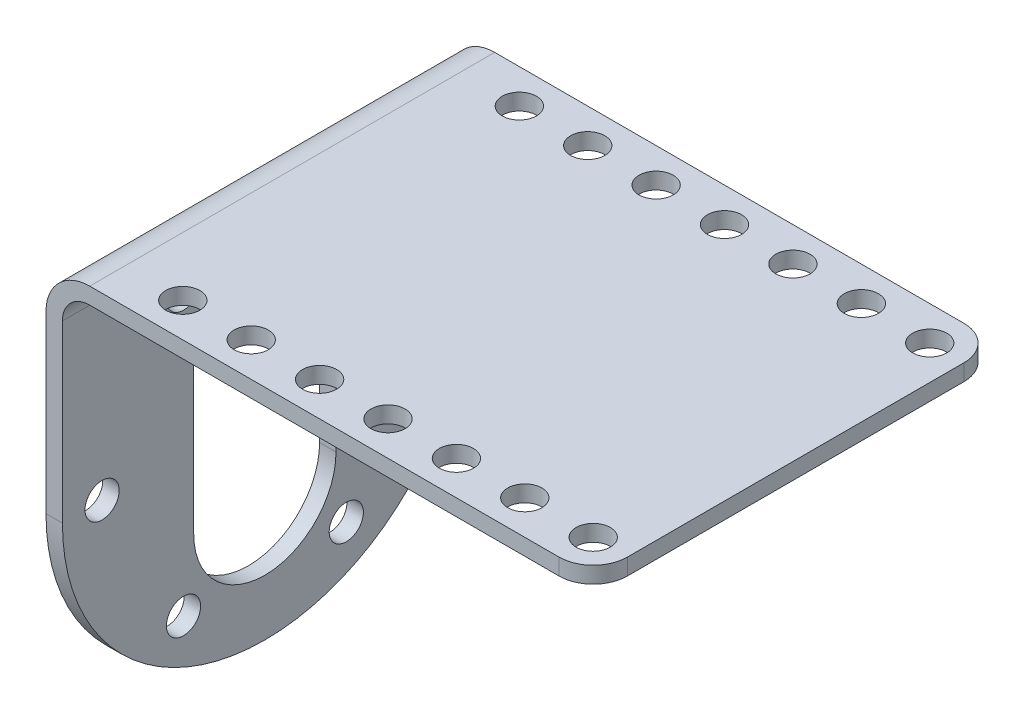
ISO-10303-21;
HEADER;
FILE_DESCRIPTION(('STEP AP214'),'2;1');
FILE_NAME('part.step','',(''),(''),'','','');
FILE_SCHEMA(('AUTOMOTIVE_DESIGN { 1 0 10303 214 1 1 1 1 }'));
ENDSEC;
DATA;
#1=APPLICATION_CONTEXT('core data for automotive mechanical design processes');
#2=APPLICATION_PROTOCOL_DEFINITION('international standard','automotive_design',2000,#1);
#3=PRODUCT_CONTEXT('',#1,'mechanical');
#4=PRODUCT('Part','Part','',(#3));
#5=PRODUCT_RELATED_PRODUCT_CATEGORY('part','',(#4));
#6=PRODUCT_DEFINITION_FORMATION('','',#4);
#7=PRODUCT_DEFINITION_CONTEXT('part definition',#1,'design');
#8=PRODUCT_DEFINITION('design','',#6,#7);
#9=PRODUCT_DEFINITION_SHAPE('','',#8);
#10=(LENGTH_UNIT() NAMED_UNIT(*) SI_UNIT(.MILLI.,.METRE.));
#11=(NAMED_UNIT(*) PLANE_ANGLE_UNIT() SI_UNIT($,.RADIAN.));
#12=(NAMED_UNIT(*) SI_UNIT($,.STERADIAN.) SOLID_ANGLE_UNIT());
#13=UNCERTAINTY_MEASURE_WITH_UNIT(LENGTH_MEASURE(1.E-05),#10,'distance_accuracy_value','');
#14=(GEOMETRIC_REPRESENTATION_CONTEXT(3) GLOBAL_UNCERTAINTY_ASSIGNED_CONTEXT((#13)) GLOBAL_UNIT_ASSIGNED_CONTEXT((#10,
#11,#12)) REPRESENTATION_CONTEXT('',''));
#15=CARTESIAN_POINT('',(0.,0.,0.));
#16=DIRECTION('',(0.,0.,1.));
#17=DIRECTION('',(1.,0.,0.));
#18=AXIS2_PLACEMENT_3D('',#15,#16,#17);
#19=CARTESIAN_POINT('',(4.064,39.116,18.796));
#20=DIRECTION('',(0.,-1.,0.));
#21=DIRECTION('',(0.,0.,-1.));
#22=AXIS2_PLACEMENT_3D('',#19,#20,#21);
#23=PLANE('',#22);
#24=CARTESIAN_POINT('',(9.52499999999999,39.116,15.621));
#25=DIRECTION('',(0.,1.,0.));
#26=DIRECTION('',(0.,0.,1.));
#27=AXIS2_PLACEMENT_3D('',#24,#25,#26);
#28=CIRCLE('',#27,1.5875);
#29=CARTESIAN_POINT('',(9.52499999999999,39.116,17.2085));
#30=VERTEX_POINT('',#29);
#31=EDGE_CURVE('E645',#30,#30,#28,.T.);
#32=ORIENTED_EDGE('',*,*,#31,.F.);
#33=EDGE_LOOP('',(#32));
#34=FACE_BOUND('',#33,.T.);
#35=CARTESIAN_POINT('',(15.875,39.116,15.621));
#36=DIRECTION('',(0.,1.,0.));
#37=DIRECTION('',(0.,0.,1.));
#38=AXIS2_PLACEMENT_3D('',#35,#36,#37);
#39=CIRCLE('',#38,1.5875);
#40=CARTESIAN_POINT('',(15.875,39.116,17.2085));
#41=VERTEX_POINT('',#40);
#42=EDGE_CURVE('E649',#41,#41,#39,.T.);
#43=ORIENTED_EDGE('',*,*,#42,.F.);
#44=EDGE_LOOP('',(#43));
#45=FACE_BOUND('',#44,.T.);
#46=CARTESIAN_POINT('',(22.225,39.116,15.621));
#47=DIRECTION('',(0.,1.,0.));
#48=DIRECTION('',(0.,0.,1.));
#49=AXIS2_PLACEMENT_3D('',#46,#47,#48);
#50=CIRCLE('',#49,1.5875);
#51=CARTESIAN_POINT('',(22.225,39.116,17.2085));
#52=VERTEX_POINT('',#51);
#53=EDGE_CURVE('E658',#52,#52,#50,.T.);
#54=ORIENTED_EDGE('',*,*,#53,.F.);
#55=EDGE_LOOP('',(#54));
#56=FACE_BOUND('',#55,.T.);
#57=CARTESIAN_POINT('',(28.575,39.116,15.621));
#58=DIRECTION('',(0.,1.,0.));
#59=DIRECTION('',(0.,0.,1.));
#60=AXIS2_PLACEMENT_3D('',#57,#58,#59);
#61=CIRCLE('',#60,1.5875);
#62=CARTESIAN_POINT('',(28.575,39.116,17.2085));
#63=VERTEX_POINT('',#62);
#64=EDGE_CURVE('E664',#63,#63,#61,.T.);
#65=ORIENTED_EDGE('',*,*,#64,.F.);
#66=EDGE_LOOP('',(#65));
#67=FACE_BOUND('',#66,.T.);
#68=CARTESIAN_POINT('',(34.925,39.116,15.621));
#69=DIRECTION('',(0.,1.,0.));
#70=DIRECTION('',(0.,0.,1.));
#71=AXIS2_PLACEMENT_3D('',#68,#69,#70);
#72=CIRCLE('',#71,1.58749999999999);
#73=CARTESIAN_POINT('',(34.925,39.116,17.2085));
#74=VERTEX_POINT('',#73);
#75=EDGE_CURVE('E670',#74,#74,#72,.T.);
#76=ORIENTED_EDGE('',*,*,#75,.F.);
#77=EDGE_LOOP('',(#76));
#78=FACE_BOUND('',#77,.T.);
#79=CARTESIAN_POINT('',(41.275,39.116,15.621));
#80=DIRECTION('',(0.,1.,0.));
#81=DIRECTION('',(0.,0.,1.));
#82=AXIS2_PLACEMENT_3D('',#79,#80,#81);
#83=CIRCLE('',#82,1.5875);
#84=CARTESIAN_POINT('',(41.275,39.116,17.2085));
#85=VERTEX_POINT('',#84);
#86=EDGE_CURVE('E676',#85,#85,#83,.T.);
#87=ORIENTED_EDGE('',*,*,#86,.F.);
#88=EDGE_LOOP('',(#87));
#89=FACE_BOUND('',#88,.T.);
#90=CARTESIAN_POINT('',(47.625,39.116,15.621));
#91=DIRECTION('',(0.,1.,0.));
#92=DIRECTION('',(0.,0.,1.));
#93=AXIS2_PLACEMENT_3D('',#90,#91,#92);
#94=CIRCLE('',#93,1.58749999999999);
#95=CARTESIAN_POINT('',(47.625,39.116,17.2085));
#96=VERTEX_POINT('',#95);
#97=EDGE_CURVE('E682',#96,#96,#94,.T.);
#98=ORIENTED_EDGE('',*,*,#97,.F.);
#99=EDGE_LOOP('',(#98));
#100=FACE_BOUND('',#99,.T.);
#101=CARTESIAN_POINT('',(9.52499999999999,39.116,-15.621));
#102=DIRECTION('',(0.,1.,0.));
#103=DIRECTION('',(0.,0.,1.));
#104=AXIS2_PLACEMENT_3D('',#101,#102,#103);
#105=CIRCLE('',#104,1.5875);
#106=CARTESIAN_POINT('',(9.52499999999999,39.116,-14.0335));
#107=VERTEX_POINT('',#106);
#108=EDGE_CURVE('E688',#107,#107,#105,.T.);
#109=ORIENTED_EDGE('',*,*,#108,.F.);
#110=EDGE_LOOP('',(#109));
#111=FACE_BOUND('',#110,.T.);
#112=CARTESIAN_POINT('',(15.875,39.116,-15.621));
#113=DIRECTION('',(0.,1.,0.));
#114=DIRECTION('',(0.,0.,1.));
#115=AXIS2_PLACEMENT_3D('',#112,#113,#114);
#116=CIRCLE('',#115,1.5875);
#117=CARTESIAN_POINT('',(15.875,39.116,-14.0335));
#118=VERTEX_POINT('',#117);
#119=EDGE_CURVE('E694',#118,#118,#116,.T.);
#120=ORIENTED_EDGE('',*,*,#119,.F.);
#121=EDGE_LOOP('',(#120));
#122=FACE_BOUND('',#121,.T.);
#123=CARTESIAN_POINT('',(22.225,39.116,-15.621));
#124=DIRECTION('',(0.,1.,0.));
#125=DIRECTION('',(0.,0.,1.));
#126=AXIS2_PLACEMENT_3D('',#123,#124,#125);
#127=CIRCLE('',#126,1.5875);
#128=CARTESIAN_POINT('',(22.225,39.116,-14.0335));
#129=VERTEX_POINT('',#128);
#130=EDGE_CURVE('E700',#129,#129,#127,.T.);
#131=ORIENTED_EDGE('',*,*,#130,.F.);
#132=EDGE_LOOP('',(#131));
#133=FACE_BOUND('',#132,.T.);
#134=CARTESIAN_POINT('',(28.575,39.116,-15.621));
#135=DIRECTION('',(0.,1.,0.));
#136=DIRECTION('',(0.,0.,1.));
#137=AXIS2_PLACEMENT_3D('',#134,#135,#136);
#138=CIRCLE('',#137,1.5875);
#139=CARTESIAN_POINT('',(28.575,39.116,-14.0335));
#140=VERTEX_POINT('',#139);
#141=EDGE_CURVE('E706',#140,#140,#138,.T.);
#142=ORIENTED_EDGE('',*,*,#141,.F.);
#143=EDGE_LOOP('',(#142));
#144=FACE_BOUND('',#143,.T.);
#145=CARTESIAN_POINT('',(41.275,39.116,-15.621));
#146=DIRECTION('',(0.,1.,0.));
#147=DIRECTION('',(0.,0.,1.));
#148=AXIS2_PLACEMENT_3D('',#145,#146,#147);
#149=CIRCLE('',#148,1.5875);
#150=CARTESIAN_POINT('',(41.275,39.116,-14.0335));
#151=VERTEX_POINT('',#150);
#152=EDGE_CURVE('E715',#151,#151,#149,.T.);
#153=ORIENTED_EDGE('',*,*,#152,.F.);
#154=EDGE_LOOP('',(#153));
#155=FACE_BOUND('',#154,.T.);
#156=CARTESIAN_POINT('',(47.625,39.116,-15.621));
#157=DIRECTION('',(0.,1.,0.));
#158=DIRECTION('',(0.,0.,1.));
#159=AXIS2_PLACEMENT_3D('',#156,#157,#158);
#160=CIRCLE('',#159,1.58749999999999);
#161=CARTESIAN_POINT('',(47.625,39.116,-14.0335));
#162=VERTEX_POINT('',#161);
#163=EDGE_CURVE('E721',#162,#162,#160,.T.);
#164=ORIENTED_EDGE('',*,*,#163,.F.);
#165=EDGE_LOOP('',(#164));
#166=FACE_BOUND('',#165,.T.);
#167=DIRECTION('',(0.,0.,-1.));
#168=VECTOR('',#167,1.);
#169=CARTESIAN_POINT('',(50.8,39.116,18.796));
#170=LINE('',#169,#168);
#171=CARTESIAN_POINT('',(50.8,39.116,15.621));
#172=VERTEX_POINT('',#171);
#173=CARTESIAN_POINT('',(50.8,39.116,-15.621));
#174=VERTEX_POINT('',#173);
#175=EDGE_CURVE('E219',#172,#174,#170,.T.);
#176=ORIENTED_EDGE('',*,*,#175,.T.);
#177=CARTESIAN_POINT('',(47.625,39.116,-15.621));
#178=DIRECTION('',(0.,-1.,0.));
#179=DIRECTION('',(0.,0.,-1.));
#180=AXIS2_PLACEMENT_3D('',#177,#178,#179);
#181=CIRCLE('',#180,3.175);
#182=CARTESIAN_POINT('',(47.625,39.116,-18.796));
#183=VERTEX_POINT('',#182);
#184=EDGE_CURVE('E244',#174,#183,#181,.F.);
#185=ORIENTED_EDGE('',*,*,#184,.T.);
#186=DIRECTION('',(-1.,0.,0.));
#187=VECTOR('',#186,1.);
#188=CARTESIAN_POINT('',(4.064,39.116,-18.796));
#189=LINE('',#188,#187);
#190=CARTESIAN_POINT('',(4.064,39.116,-18.796));
#191=VERTEX_POINT('',#190);
#192=EDGE_CURVE('E208',#183,#191,#189,.T.);
#193=ORIENTED_EDGE('',*,*,#192,.T.);
#194=DIRECTION('',(0.,0.,-1.));
#195=VECTOR('',#194,1.);
#196=CARTESIAN_POINT('',(4.064,39.116,18.796));
#197=LINE('',#196,#195);
#198=CARTESIAN_POINT('',(4.064,39.116,18.796));
#199=VERTEX_POINT('',#198);
#200=EDGE_CURVE('E216',#199,#191,#197,.T.);
#201=ORIENTED_EDGE('',*,*,#200,.F.);
#202=DIRECTION('',(-1.,0.,0.));
#203=VECTOR('',#202,1.);
#204=CARTESIAN_POINT('',(4.064,39.116,18.796));
#205=LINE('',#204,#203);
#206=CARTESIAN_POINT('',(47.625,39.116,18.796));
#207=VERTEX_POINT('',#206);
#208=EDGE_CURVE('E195',#207,#199,#205,.T.);
#209=ORIENTED_EDGE('',*,*,#208,.F.);
#210=CARTESIAN_POINT('',(47.625,39.116,15.621));
#211=DIRECTION('',(0.,-1.,0.));
#212=DIRECTION('',(0.,0.,-1.));
#213=AXIS2_PLACEMENT_3D('',#210,#211,#212);
#214=CIRCLE('',#213,3.175);
#215=EDGE_CURVE('E242',#207,#172,#214,.F.);
#216=ORIENTED_EDGE('',*,*,#215,.T.);
#217=EDGE_LOOP('',(#176,#185,#193,#201,#209,#216));
#218=FACE_BOUND('',#217,.T.);
#219=CARTESIAN_POINT('',(34.925,39.116,-15.621));
#220=DIRECTION('',(0.,1.,0.));
#221=DIRECTION('',(0.,0.,1.));
#222=AXIS2_PLACEMENT_3D('',#219,#220,#221);
#223=CIRCLE('',#222,1.58749999999999);
#224=CARTESIAN_POINT('',(34.925,39.116,-14.0335));
#225=VERTEX_POINT('',#224);
#226=EDGE_CURVE('E709',#225,#225,#223,.T.);
#227=ORIENTED_EDGE('',*,*,#226,.F.);
#228=EDGE_LOOP('',(#227));
#229=FACE_BOUND('',#228,.T.);
#230=ADVANCED_FACE('F33',(#34,#45,#56,#67,#78,#89,#100,#111,#122,#133,#144,#155,#166,#218,#229),
#23,.F.);
#231=CARTESIAN_POINT('',(0.,0.,18.796));
#232=DIRECTION('',(1.,0.,0.));
#233=DIRECTION('',(0.,0.,-1.));
#234=AXIS2_PLACEMENT_3D('',#231,#232,#233);
#235=PLANE('',#234);
#236=CARTESIAN_POINT('',(0.,31.8842419273942,-7.5565));
#237=DIRECTION('',(-1.,0.,0.));
#238=DIRECTION('',(0.,0.,1.));
#239=AXIS2_PLACEMENT_3D('',#236,#237,#238);
#240=CIRCLE('',#239,1.58749999999999);
#241=CARTESIAN_POINT('',(0.,31.8842419273942,-5.96900000000001));
#242=VERTEX_POINT('',#241);
#243=EDGE_CURVE('E727',#242,#242,#240,.T.);
#244=ORIENTED_EDGE('',*,*,#243,.F.);
#245=EDGE_LOOP('',(#244));
#246=FACE_BOUND('',#245,.T.);
#247=CARTESIAN_POINT('',(0.,31.8842419273942,7.5565));
#248=DIRECTION('',(-1.,0.,0.));
#249=DIRECTION('',(0.,0.,1.));
#250=AXIS2_PLACEMENT_3D('',#247,#248,#249);
#251=CIRCLE('',#250,1.58749999999999);
#252=CARTESIAN_POINT('',(0.,31.8842419273942,9.14399999999999));
#253=VERTEX_POINT('',#252);
#254=EDGE_CURVE('E731',#253,#253,#251,.T.);
#255=ORIENTED_EDGE('',*,*,#254,.F.);
#256=EDGE_LOOP('',(#255));
#257=FACE_BOUND('',#256,.T.);
#258=CARTESIAN_POINT('',(0.,18.796,15.113));
#259=DIRECTION('',(-1.,0.,0.));
#260=DIRECTION('',(0.,0.,1.));
#261=AXIS2_PLACEMENT_3D('',#258,#259,#260);
#262=CIRCLE('',#261,1.5875);
#263=CARTESIAN_POINT('',(0.,18.796,16.7005));
#264=VERTEX_POINT('',#263);
#265=EDGE_CURVE('E735',#264,#264,#262,.T.);
#266=ORIENTED_EDGE('',*,*,#265,.F.);
#267=EDGE_LOOP('',(#266));
#268=FACE_BOUND('',#267,.T.);
#269=CARTESIAN_POINT('',(0.,5.70775807260578,7.5565));
#270=DIRECTION('',(-1.,0.,0.));
#271=DIRECTION('',(0.,0.,1.));
#272=AXIS2_PLACEMENT_3D('',#269,#270,#271);
#273=CIRCLE('',#272,1.58749999999999);
#274=CARTESIAN_POINT('',(0.,5.70775807260578,9.144));
#275=VERTEX_POINT('',#274);
#276=EDGE_CURVE('E739',#275,#275,#273,.T.);
#277=ORIENTED_EDGE('',*,*,#276,.F.);
#278=EDGE_LOOP('',(#277));
#279=FACE_BOUND('',#278,.T.);
#280=CARTESIAN_POINT('',(0.,5.70775807260578,-7.55649999999998));
#281=DIRECTION('',(-1.,0.,0.));
#282=DIRECTION('',(0.,0.,1.));
#283=AXIS2_PLACEMENT_3D('',#280,#281,#282);
#284=CIRCLE('',#283,1.58749999999999);
#285=CARTESIAN_POINT('',(0.,5.70775807260578,-5.96899999999999));
#286=VERTEX_POINT('',#285);
#287=EDGE_CURVE('E743',#286,#286,#284,.T.);
#288=ORIENTED_EDGE('',*,*,#287,.F.);
#289=EDGE_LOOP('',(#288));
#290=FACE_BOUND('',#289,.T.);
#291=DIRECTION('',(0.,1.,0.));
#292=VECTOR('',#291,1.);
#293=CARTESIAN_POINT('',(0.,11.811,6.604));
#294=LINE('',#293,#292);
#295=CARTESIAN_POINT('',(0.,11.811,6.604));
#296=VERTEX_POINT('',#295);
#297=CARTESIAN_POINT('',(0.,25.781,6.604));
#298=VERTEX_POINT('',#297);
#299=EDGE_CURVE('E155',#296,#298,#294,.T.);
#300=ORIENTED_EDGE('',*,*,#299,.F.);
#301=CARTESIAN_POINT('',(0.,11.811,0.));
#302=DIRECTION('',(-1.,0.,0.));
#303=DIRECTION('',(0.,0.,1.));
#304=AXIS2_PLACEMENT_3D('',#301,#302,#303);
#305=CIRCLE('',#304,6.604);
#306=CARTESIAN_POINT('',(0.,11.811,-6.604));
#307=VERTEX_POINT('',#306);
#308=EDGE_CURVE('E160',#307,#296,#305,.T.);
#309=ORIENTED_EDGE('',*,*,#308,.F.);
#310=DIRECTION('',(0.,-1.,0.));
#311=VECTOR('',#310,1.);
#312=CARTESIAN_POINT('',(0.,11.811,-6.604));
#313=LINE('',#312,#311);
#314=CARTESIAN_POINT('',(0.,25.781,-6.604));
#315=VERTEX_POINT('',#314);
#316=EDGE_CURVE('E165',#315,#307,#313,.T.);
#317=ORIENTED_EDGE('',*,*,#316,.F.);
#318=CARTESIAN_POINT('',(0.,25.781,0.));
#319=DIRECTION('',(-1.,0.,0.));
#320=DIRECTION('',(0.,0.,1.));
#321=AXIS2_PLACEMENT_3D('',#318,#319,#320);
#322=CIRCLE('',#321,6.604);
#323=EDGE_CURVE('E144',#298,#315,#322,.T.);
#324=ORIENTED_EDGE('',*,*,#323,.F.);
#325=EDGE_LOOP('',(#300,#309,#317,#324));
#326=FACE_BOUND('',#325,.T.);
#327=CARTESIAN_POINT('',(0.,18.796,0.));
#328=DIRECTION('',(-1.,0.,0.));
#329=DIRECTION('',(0.,0.,1.));
#330=AXIS2_PLACEMENT_3D('',#327,#328,#329);
#331=CIRCLE('',#330,18.796);
#332=CARTESIAN_POINT('',(0.,18.796,-18.796));
#333=VERTEX_POINT('',#332);
#334=CARTESIAN_POINT('',(0.,18.796,18.796));
#335=VERTEX_POINT('',#334);
#336=EDGE_CURVE('E183',#333,#335,#331,.T.);
#337=ORIENTED_EDGE('',*,*,#336,.T.);
#338=DIRECTION('',(0.,-1.,0.));
#339=VECTOR('',#338,1.);
#340=CARTESIAN_POINT('',(0.,0.,18.796));
#341=LINE('',#340,#339);
#342=CARTESIAN_POINT('',(0.,35.052,18.796));
#343=VERTEX_POINT('',#342);
#344=EDGE_CURVE('E199',#343,#335,#341,.T.);
#345=ORIENTED_EDGE('',*,*,#344,.F.);
#346=DIRECTION('',(0.,0.,-1.));
#347=VECTOR('',#346,1.);
#348=CARTESIAN_POINT('',(0.,35.052,18.796));
#349=LINE('',#348,#347);
#350=CARTESIAN_POINT('',(0.,35.052,-18.796));
#351=VERTEX_POINT('',#350);
#352=EDGE_CURVE('E202',#343,#351,#349,.T.);
#353=ORIENTED_EDGE('',*,*,#352,.T.);
#354=DIRECTION('',(0.,-1.,0.));
#355=VECTOR('',#354,1.);
#356=CARTESIAN_POINT('',(0.,0.,-18.796));
#357=LINE('',#356,#355);
#358=EDGE_CURVE('E191',#351,#333,#357,.T.);
#359=ORIENTED_EDGE('',*,*,#358,.T.);
#360=EDGE_LOOP('',(#337,#345,#353,#359));
#361=FACE_BOUND('',#360,.T.);
#362=CARTESIAN_POINT('',(0.,18.796,-15.113));
#363=DIRECTION('',(-1.,0.,0.));
#364=DIRECTION('',(0.,0.,1.));
#365=AXIS2_PLACEMENT_3D('',#362,#363,#364);
#366=CIRCLE('',#365,1.5875);
#367=CARTESIAN_POINT('',(0.,18.796,-13.5255));
#368=VERTEX_POINT('',#367);
#369=EDGE_CURVE('E747',#368,#368,#366,.T.);
#370=ORIENTED_EDGE('',*,*,#369,.F.);
#371=EDGE_LOOP('',(#370));
#372=FACE_BOUND('',#371,.T.);
#373=ADVANCED_FACE('F162',(#246,#257,#268,#279,#290,#326,#361,#372),#235,.F.);
#374=CARTESIAN_POINT('',(1.524,35.052,18.796));
#375=DIRECTION('',(-1.,0.,0.));
#376=DIRECTION('',(0.,-1.,0.));
#377=AXIS2_PLACEMENT_3D('',#374,#375,#376);
#378=PLANE('',#377);
#379=CARTESIAN_POINT('',(1.524,31.8842419273942,-7.5565));
#380=DIRECTION('',(-1.,0.,0.));
#381=DIRECTION('',(0.,-1.,0.));
#382=AXIS2_PLACEMENT_3D('',#379,#380,#381);
#383=CIRCLE('',#382,1.58749999999999);
#384=CARTESIAN_POINT('',(1.524,30.2967419273942,-7.5565));
#385=VERTEX_POINT('',#384);
#386=EDGE_CURVE('E317',#385,#385,#383,.T.);
#387=ORIENTED_EDGE('',*,*,#386,.T.);
#388=EDGE_LOOP('',(#387));
#389=FACE_BOUND('',#388,.T.);
#390=CARTESIAN_POINT('',(1.524,31.8842419273942,7.5565));
#391=DIRECTION('',(-1.,0.,0.));
#392=DIRECTION('',(0.,-1.,0.));
#393=AXIS2_PLACEMENT_3D('',#390,#391,#392);
#394=CIRCLE('',#393,1.58749999999999);
#395=CARTESIAN_POINT('',(1.524,30.2967419273942,7.5565));
#396=VERTEX_POINT('',#395);
#397=EDGE_CURVE('E321',#396,#396,#394,.T.);
#398=ORIENTED_EDGE('',*,*,#397,.T.);
#399=EDGE_LOOP('',(#398));
#400=FACE_BOUND('',#399,.T.);
#401=CARTESIAN_POINT('',(1.524,18.796,15.113));
#402=DIRECTION('',(-1.,0.,0.));
#403=DIRECTION('',(0.,-1.,0.));
#404=AXIS2_PLACEMENT_3D('',#401,#402,#403);
#405=CIRCLE('',#404,1.58749999999999);
#406=CARTESIAN_POINT('',(1.524,17.2085,15.113));
#407=VERTEX_POINT('',#406);
#408=EDGE_CURVE('E325',#407,#407,#405,.T.);
#409=ORIENTED_EDGE('',*,*,#408,.T.);
#410=EDGE_LOOP('',(#409));
#411=FACE_BOUND('',#410,.T.);
#412=CARTESIAN_POINT('',(1.524,5.70775807260578,7.5565));
#413=DIRECTION('',(-1.,0.,0.));
#414=DIRECTION('',(0.,-1.,0.));
#415=AXIS2_PLACEMENT_3D('',#412,#413,#414);
#416=CIRCLE('',#415,1.58749999999999);
#417=CARTESIAN_POINT('',(1.524,4.12025807260579,7.5565));
#418=VERTEX_POINT('',#417);
#419=EDGE_CURVE('E329',#418,#418,#416,.T.);
#420=ORIENTED_EDGE('',*,*,#419,.T.);
#421=EDGE_LOOP('',(#420));
#422=FACE_BOUND('',#421,.T.);
#423=CARTESIAN_POINT('',(1.524,5.70775807260578,-7.55649999999998));
#424=DIRECTION('',(-1.,0.,0.));
#425=DIRECTION('',(0.,-1.,0.));
#426=AXIS2_PLACEMENT_3D('',#423,#424,#425);
#427=CIRCLE('',#426,1.58749999999999);
#428=CARTESIAN_POINT('',(1.524,4.12025807260579,-7.55649999999998));
#429=VERTEX_POINT('',#428);
#430=EDGE_CURVE('E333',#429,#429,#427,.T.);
#431=ORIENTED_EDGE('',*,*,#430,.T.);
#432=EDGE_LOOP('',(#431));
#433=FACE_BOUND('',#432,.T.);
#434=CARTESIAN_POINT('',(1.524,18.796,-15.113));
#435=DIRECTION('',(-1.,0.,0.));
#436=DIRECTION('',(0.,-1.,0.));
#437=AXIS2_PLACEMENT_3D('',#434,#435,#436);
#438=CIRCLE('',#437,1.58749999999999);
#439=CARTESIAN_POINT('',(1.524,17.2085,-15.113));
#440=VERTEX_POINT('',#439);
#441=EDGE_CURVE('E337',#440,#440,#438,.T.);
#442=ORIENTED_EDGE('',*,*,#441,.T.);
#443=EDGE_LOOP('',(#442));
#444=FACE_BOUND('',#443,.T.);
#445=DIRECTION('',(0.,-1.,0.));
#446=VECTOR('',#445,1.);
#447=CARTESIAN_POINT('',(1.524,35.052,-6.604));
#448=LINE('',#447,#446);
#449=CARTESIAN_POINT('',(1.524,25.781,-6.604));
#450=VERTEX_POINT('',#449);
#451=CARTESIAN_POINT('',(1.524,11.811,-6.604));
#452=VERTEX_POINT('',#451);
#453=EDGE_CURVE('E177',#450,#452,#448,.T.);
#454=ORIENTED_EDGE('',*,*,#453,.T.);
#455=CARTESIAN_POINT('',(1.524,11.811,0.));
#456=DIRECTION('',(-1.,0.,0.));
#457=DIRECTION('',(0.,-1.,0.));
#458=AXIS2_PLACEMENT_3D('',#455,#456,#457);
#459=CIRCLE('',#458,6.604);
#460=CARTESIAN_POINT('',(1.524,11.811,6.604));
#461=VERTEX_POINT('',#460);
#462=EDGE_CURVE('E180',#452,#461,#459,.T.);
#463=ORIENTED_EDGE('',*,*,#462,.T.);
#464=DIRECTION('',(0.,1.,0.));
#465=VECTOR('',#464,1.);
#466=CARTESIAN_POINT('',(1.524,35.052,6.604));
#467=LINE('',#466,#465);
#468=CARTESIAN_POINT('',(1.524,25.781,6.604));
#469=VERTEX_POINT('',#468);
#470=EDGE_CURVE('E172',#461,#469,#467,.T.);
#471=ORIENTED_EDGE('',*,*,#470,.T.);
#472=CARTESIAN_POINT('',(1.524,25.781,0.));
#473=DIRECTION('',(-1.,0.,0.));
#474=DIRECTION('',(0.,-1.,0.));
#475=AXIS2_PLACEMENT_3D('',#472,#473,#474);
#476=CIRCLE('',#475,6.604);
#477=EDGE_CURVE('E147',#469,#450,#476,.T.);
#478=ORIENTED_EDGE('',*,*,#477,.T.);
#479=EDGE_LOOP('',(#454,#463,#471,#478));
#480=FACE_BOUND('',#479,.T.);
#481=DIRECTION('',(0.,1.,0.));
#482=VECTOR('',#481,1.);
#483=CARTESIAN_POINT('',(1.524,35.052,18.796));
#484=LINE('',#483,#482);
#485=CARTESIAN_POINT('',(1.524,18.796,18.796));
#486=VERTEX_POINT('',#485);
#487=CARTESIAN_POINT('',(1.52399999999999,35.052,18.796));
#488=VERTEX_POINT('',#487);
#489=EDGE_CURVE('E188',#486,#488,#484,.T.);
#490=ORIENTED_EDGE('',*,*,#489,.F.);
#491=CARTESIAN_POINT('',(1.524,18.796,0.));
#492=DIRECTION('',(-1.,0.,0.));
#493=DIRECTION('',(0.,-1.,0.));
#494=AXIS2_PLACEMENT_3D('',#491,#492,#493);
#495=CIRCLE('',#494,18.796);
#496=CARTESIAN_POINT('',(1.524,18.796,-18.796));
#497=VERTEX_POINT('',#496);
#498=EDGE_CURVE('E185',#497,#486,#495,.T.);
#499=ORIENTED_EDGE('',*,*,#498,.F.);
#500=DIRECTION('',(0.,1.,0.));
#501=VECTOR('',#500,1.);
#502=CARTESIAN_POINT('',(1.524,35.052,-18.796));
#503=LINE('',#502,#501);
#504=CARTESIAN_POINT('',(1.52399999999999,35.052,-18.796));
#505=VERTEX_POINT('',#504);
#506=EDGE_CURVE('E187',#497,#505,#503,.T.);
#507=ORIENTED_EDGE('',*,*,#506,.T.);
#508=DIRECTION('',(0.,0.,-1.));
#509=VECTOR('',#508,1.);
#510=CARTESIAN_POINT('',(1.52399999999999,35.052,18.796));
#511=LINE('',#510,#509);
#512=EDGE_CURVE('E228',#488,#505,#511,.T.);
#513=ORIENTED_EDGE('',*,*,#512,.F.);
#514=EDGE_LOOP('',(#490,#499,#507,#513));
#515=FACE_BOUND('',#514,.T.);
#516=ADVANCED_FACE('F292',(#389,#400,#411,#422,#433,#444,#480,#515),#378,.F.);
#517=CARTESIAN_POINT('',(4.064,35.052,18.796));
#518=DIRECTION('',(0.,0.,-1.));
#519=DIRECTION('',(-1.,0.,0.));
#520=AXIS2_PLACEMENT_3D('',#517,#518,#519);
#521=PLANE('',#520);
#522=DIRECTION('',(1.,0.,0.));
#523=VECTOR('',#522,1.);
#524=CARTESIAN_POINT('',(50.8,37.592,18.796));
#525=LINE('',#524,#523);
#526=CARTESIAN_POINT('',(4.06400000000001,37.592,18.796));
#527=VERTEX_POINT('',#526);
#528=CARTESIAN_POINT('',(47.625,37.592,18.796));
#529=VERTEX_POINT('',#528);
#530=EDGE_CURVE('E193',#527,#529,#525,.T.);
#531=ORIENTED_EDGE('',*,*,#530,.T.);
#532=DIRECTION('',(0.,1.,0.));
#533=VECTOR('',#532,1.);
#534=CARTESIAN_POINT('',(47.625,35.052,18.796));
#535=LINE('',#534,#533);
#536=EDGE_CURVE('E11',#529,#207,#535,.T.);
#537=ORIENTED_EDGE('',*,*,#536,.T.);
#538=ORIENTED_EDGE('',*,*,#208,.T.);
#539=CARTESIAN_POINT('',(4.064,35.052,18.796));
#540=DIRECTION('',(0.,0.,1.));
#541=DIRECTION('',(-1.,0.,0.));
#542=AXIS2_PLACEMENT_3D('',#539,#540,#541);
#543=CIRCLE('',#542,4.064);
#544=EDGE_CURVE('E197',#199,#343,#543,.T.);
#545=ORIENTED_EDGE('',*,*,#544,.T.);
#546=ORIENTED_EDGE('',*,*,#344,.T.);
#547=DIRECTION('',(-1.,0.,0.));
#548=VECTOR('',#547,1.);
#549=CARTESIAN_POINT('',(50.8,18.796,18.796));
#550=LINE('',#549,#548);
#551=EDGE_CURVE('E234',#486,#335,#550,.T.);
#552=ORIENTED_EDGE('',*,*,#551,.F.);
#553=ORIENTED_EDGE('',*,*,#489,.T.);
#554=CARTESIAN_POINT('',(4.06399999999999,35.052,18.796));
#555=DIRECTION('',(0.,0.,-1.));
#556=DIRECTION('',(1.,0.,0.));
#557=AXIS2_PLACEMENT_3D('',#554,#555,#556);
#558=CIRCLE('',#557,2.54);
#559=EDGE_CURVE('E190',#488,#527,#558,.T.);
#560=ORIENTED_EDGE('',*,*,#559,.T.);
#561=EDGE_LOOP('',(#531,#537,#538,#545,#546,#552,#553,#560));
#562=FACE_BOUND('',#561,.T.);
#563=ADVANCED_FACE('F271',(#562),#521,.F.);
#564=CARTESIAN_POINT('',(4.064,35.052,-18.796));
#565=DIRECTION('',(0.,0.,-1.));
#566=DIRECTION('',(-1.,0.,0.));
#567=AXIS2_PLACEMENT_3D('',#564,#565,#566);
#568=PLANE('',#567);
#569=ORIENTED_EDGE('',*,*,#192,.F.);
#570=DIRECTION('',(0.,1.,0.));
#571=VECTOR('',#570,1.);
#572=CARTESIAN_POINT('',(47.625,37.592,-18.796));
#573=LINE('',#572,#571);
#574=CARTESIAN_POINT('',(47.625,37.592,-18.796));
#575=VERTEX_POINT('',#574);
#576=EDGE_CURVE('E57',#183,#575,#573,.F.);
#577=ORIENTED_EDGE('',*,*,#576,.T.);
#578=DIRECTION('',(1.,0.,0.));
#579=VECTOR('',#578,1.);
#580=CARTESIAN_POINT('',(50.8,37.592,-18.796));
#581=LINE('',#580,#579);
#582=CARTESIAN_POINT('',(4.06400000000001,37.592,-18.796));
#583=VERTEX_POINT('',#582);
#584=EDGE_CURVE('E206',#583,#575,#581,.T.);
#585=ORIENTED_EDGE('',*,*,#584,.F.);
#586=CARTESIAN_POINT('',(4.06399999999999,35.052,-18.796));
#587=DIRECTION('',(0.,0.,-1.));
#588=DIRECTION('',(1.,0.,0.));
#589=AXIS2_PLACEMENT_3D('',#586,#587,#588);
#590=CIRCLE('',#589,2.54);
#591=EDGE_CURVE('E204',#505,#583,#590,.T.);
#592=ORIENTED_EDGE('',*,*,#591,.F.);
#593=ORIENTED_EDGE('',*,*,#506,.F.);
#594=DIRECTION('',(-1.,0.,0.));
#595=VECTOR('',#594,1.);
#596=CARTESIAN_POINT('',(50.8,18.796,-18.796));
#597=LINE('',#596,#595);
#598=EDGE_CURVE('E231',#497,#333,#597,.T.);
#599=ORIENTED_EDGE('',*,*,#598,.T.);
#600=ORIENTED_EDGE('',*,*,#358,.F.);
#601=CARTESIAN_POINT('',(4.064,35.052,-18.796));
#602=DIRECTION('',(0.,0.,1.));
#603=DIRECTION('',(-1.,0.,0.));
#604=AXIS2_PLACEMENT_3D('',#601,#602,#603);
#605=CIRCLE('',#604,4.064);
#606=EDGE_CURVE('E210',#191,#351,#605,.T.);
#607=ORIENTED_EDGE('',*,*,#606,.F.);
#608=EDGE_LOOP('',(#569,#577,#585,#592,#593,#599,#600,#607));
#609=FACE_BOUND('',#608,.T.);
#610=ADVANCED_FACE('F261',(#609),#568,.T.);
#611=CARTESIAN_POINT('',(4.06399999999999,35.052,18.796));
#612=DIRECTION('',(0.,0.,-1.));
#613=DIRECTION('',(-1.,0.,0.));
#614=AXIS2_PLACEMENT_3D('',#611,#612,#613);
#615=CYLINDRICAL_SURFACE('',#614,2.54);
#616=ORIENTED_EDGE('',*,*,#591,.T.);
#617=DIRECTION('',(0.,0.,-1.));
#618=VECTOR('',#617,1.);
#619=CARTESIAN_POINT('',(4.06400000000001,37.592,18.796));
#620=LINE('',#619,#618);
#621=EDGE_CURVE('E225',#527,#583,#620,.T.);
#622=ORIENTED_EDGE('',*,*,#621,.F.);
#623=ORIENTED_EDGE('',*,*,#559,.F.);
#624=ORIENTED_EDGE('',*,*,#512,.T.);
#625=EDGE_LOOP('',(#616,#622,#623,#624));
#626=FACE_BOUND('',#625,.T.);
#627=ADVANCED_FACE('F303',(#626),#615,.F.);
#628=CARTESIAN_POINT('',(50.8,37.592,18.796));
#629=DIRECTION('',(0.,1.,0.));
#630=DIRECTION('',(-1.,0.,0.));
#631=AXIS2_PLACEMENT_3D('',#628,#629,#630);
#632=PLANE('',#631);
#633=CARTESIAN_POINT('',(9.52499999999999,37.592,15.621));
#634=DIRECTION('',(0.,1.,0.));
#635=DIRECTION('',(-1.,0.,0.));
#636=AXIS2_PLACEMENT_3D('',#633,#634,#635);
#637=CIRCLE('',#636,1.58749999999999);
#638=CARTESIAN_POINT('',(7.9375,37.592,15.621));
#639=VERTEX_POINT('',#638);
#640=EDGE_CURVE('E648',#639,#639,#637,.T.);
#641=ORIENTED_EDGE('',*,*,#640,.T.);
#642=EDGE_LOOP('',(#641));
#643=FACE_BOUND('',#642,.T.);
#644=CARTESIAN_POINT('',(15.875,37.592,15.621));
#645=DIRECTION('',(0.,1.,0.));
#646=DIRECTION('',(-1.,0.,0.));
#647=AXIS2_PLACEMENT_3D('',#644,#645,#646);
#648=CIRCLE('',#647,1.58749999999999);
#649=CARTESIAN_POINT('',(14.2875,37.592,15.621));
#650=VERTEX_POINT('',#649);
#651=EDGE_CURVE('E652',#650,#650,#648,.T.);
#652=ORIENTED_EDGE('',*,*,#651,.T.);
#653=EDGE_LOOP('',(#652));
#654=FACE_BOUND('',#653,.T.);
#655=CARTESIAN_POINT('',(22.225,37.592,15.621));
#656=DIRECTION('',(0.,1.,0.));
#657=DIRECTION('',(-1.,0.,0.));
#658=AXIS2_PLACEMENT_3D('',#655,#656,#657);
#659=CIRCLE('',#658,1.58749999999999);
#660=CARTESIAN_POINT('',(20.6375,37.592,15.621));
#661=VERTEX_POINT('',#660);
#662=EDGE_CURVE('E661',#661,#661,#659,.T.);
#663=ORIENTED_EDGE('',*,*,#662,.T.);
#664=EDGE_LOOP('',(#663));
#665=FACE_BOUND('',#664,.T.);
#666=CARTESIAN_POINT('',(28.575,37.592,15.621));
#667=DIRECTION('',(0.,1.,0.));
#668=DIRECTION('',(-1.,0.,0.));
#669=AXIS2_PLACEMENT_3D('',#666,#667,#668);
#670=CIRCLE('',#669,1.58749999999999);
#671=CARTESIAN_POINT('',(26.9875,37.592,15.621));
#672=VERTEX_POINT('',#671);
#673=EDGE_CURVE('E667',#672,#672,#670,.T.);
#674=ORIENTED_EDGE('',*,*,#673,.T.);
#675=EDGE_LOOP('',(#674));
#676=FACE_BOUND('',#675,.T.);
#677=CARTESIAN_POINT('',(34.925,37.592,15.621));
#678=DIRECTION('',(0.,1.,0.));
#679=DIRECTION('',(-1.,0.,0.));
#680=AXIS2_PLACEMENT_3D('',#677,#678,#679);
#681=CIRCLE('',#680,1.58749999999999);
#682=CARTESIAN_POINT('',(33.3375,37.592,15.621));
#683=VERTEX_POINT('',#682);
#684=EDGE_CURVE('E673',#683,#683,#681,.T.);
#685=ORIENTED_EDGE('',*,*,#684,.T.);
#686=EDGE_LOOP('',(#685));
#687=FACE_BOUND('',#686,.T.);
#688=CARTESIAN_POINT('',(41.275,37.592,15.621));
#689=DIRECTION('',(0.,1.,0.));
#690=DIRECTION('',(-1.,0.,0.));
#691=AXIS2_PLACEMENT_3D('',#688,#689,#690);
#692=CIRCLE('',#691,1.5875);
#693=CARTESIAN_POINT('',(39.6875,37.592,15.621));
#694=VERTEX_POINT('',#693);
#695=EDGE_CURVE('E679',#694,#694,#692,.T.);
#696=ORIENTED_EDGE('',*,*,#695,.T.);
#697=EDGE_LOOP('',(#696));
#698=FACE_BOUND('',#697,.T.);
#699=CARTESIAN_POINT('',(47.625,37.592,15.621));
#700=DIRECTION('',(0.,1.,0.));
#701=DIRECTION('',(-1.,0.,0.));
#702=AXIS2_PLACEMENT_3D('',#699,#700,#701);
#703=CIRCLE('',#702,1.58749999999999);
#704=CARTESIAN_POINT('',(46.0375,37.592,15.621));
#705=VERTEX_POINT('',#704);
#706=EDGE_CURVE('E685',#705,#705,#703,.T.);
#707=ORIENTED_EDGE('',*,*,#706,.T.);
#708=EDGE_LOOP('',(#707));
#709=FACE_BOUND('',#708,.T.);
#710=CARTESIAN_POINT('',(9.52499999999999,37.592,-15.621));
#711=DIRECTION('',(0.,1.,0.));
#712=DIRECTION('',(-1.,0.,0.));
#713=AXIS2_PLACEMENT_3D('',#710,#711,#712);
#714=CIRCLE('',#713,1.58749999999999);
#715=CARTESIAN_POINT('',(7.9375,37.592,-15.621));
#716=VERTEX_POINT('',#715);
#717=EDGE_CURVE('E691',#716,#716,#714,.T.);
#718=ORIENTED_EDGE('',*,*,#717,.T.);
#719=EDGE_LOOP('',(#718));
#720=FACE_BOUND('',#719,.T.);
#721=CARTESIAN_POINT('',(15.875,37.592,-15.621));
#722=DIRECTION('',(0.,1.,0.));
#723=DIRECTION('',(-1.,0.,0.));
#724=AXIS2_PLACEMENT_3D('',#721,#722,#723);
#725=CIRCLE('',#724,1.58749999999999);
#726=CARTESIAN_POINT('',(14.2875,37.592,-15.621));
#727=VERTEX_POINT('',#726);
#728=EDGE_CURVE('E697',#727,#727,#725,.T.);
#729=ORIENTED_EDGE('',*,*,#728,.T.);
#730=EDGE_LOOP('',(#729));
#731=FACE_BOUND('',#730,.T.);
#732=CARTESIAN_POINT('',(22.225,37.592,-15.621));
#733=DIRECTION('',(0.,1.,0.));
#734=DIRECTION('',(-1.,0.,0.));
#735=AXIS2_PLACEMENT_3D('',#732,#733,#734);
#736=CIRCLE('',#735,1.58749999999999);
#737=CARTESIAN_POINT('',(20.6375,37.592,-15.621));
#738=VERTEX_POINT('',#737);
#739=EDGE_CURVE('E703',#738,#738,#736,.T.);
#740=ORIENTED_EDGE('',*,*,#739,.T.);
#741=EDGE_LOOP('',(#740));
#742=FACE_BOUND('',#741,.T.);
#743=CARTESIAN_POINT('',(28.575,37.592,-15.621));
#744=DIRECTION('',(0.,1.,0.));
#745=DIRECTION('',(-1.,0.,0.));
#746=AXIS2_PLACEMENT_3D('',#743,#744,#745);
#747=CIRCLE('',#746,1.58749999999999);
#748=CARTESIAN_POINT('',(26.9875,37.592,-15.621));
#749=VERTEX_POINT('',#748);
#750=EDGE_CURVE('E37',#749,#749,#747,.T.);
#751=ORIENTED_EDGE('',*,*,#750,.T.);
#752=EDGE_LOOP('',(#751));
#753=FACE_BOUND('',#752,.T.);
#754=CARTESIAN_POINT('',(34.925,37.592,-15.621));
#755=DIRECTION('',(0.,1.,0.));
#756=DIRECTION('',(-1.,0.,0.));
#757=AXIS2_PLACEMENT_3D('',#754,#755,#756);
#758=CIRCLE('',#757,1.58749999999999);
#759=CARTESIAN_POINT('',(33.3375,37.592,-15.621));
#760=VERTEX_POINT('',#759);
#761=EDGE_CURVE('E712',#760,#760,#758,.T.);
#762=ORIENTED_EDGE('',*,*,#761,.T.);
#763=EDGE_LOOP('',(#762));
#764=FACE_BOUND('',#763,.T.);
#765=CARTESIAN_POINT('',(41.275,37.592,-15.621));
#766=DIRECTION('',(0.,1.,0.));
#767=DIRECTION('',(-1.,0.,0.));
#768=AXIS2_PLACEMENT_3D('',#765,#766,#767);
#769=CIRCLE('',#768,1.5875);
#770=CARTESIAN_POINT('',(39.6875,37.592,-15.621));
#771=VERTEX_POINT('',#770);
#772=EDGE_CURVE('E718',#771,#771,#769,.T.);
#773=ORIENTED_EDGE('',*,*,#772,.T.);
#774=EDGE_LOOP('',(#773));
#775=FACE_BOUND('',#774,.T.);
#776=CARTESIAN_POINT('',(47.625,37.592,-15.621));
#777=DIRECTION('',(0.,1.,0.));
#778=DIRECTION('',(-1.,0.,0.));
#779=AXIS2_PLACEMENT_3D('',#776,#777,#778);
#780=CIRCLE('',#779,1.58749999999999);
#781=CARTESIAN_POINT('',(46.0375,37.592,-15.621));
#782=VERTEX_POINT('',#781);
#783=EDGE_CURVE('E724',#782,#782,#780,.T.);
#784=ORIENTED_EDGE('',*,*,#783,.T.);
#785=EDGE_LOOP('',(#784));
#786=FACE_BOUND('',#785,.T.);
#787=ORIENTED_EDGE('',*,*,#584,.T.);
#788=CARTESIAN_POINT('',(47.625,37.592,-15.621));
#789=DIRECTION('',(0.,1.,0.));
#790=DIRECTION('',(-1.,0.,0.));
#791=AXIS2_PLACEMENT_3D('',#788,#789,#790);
#792=CIRCLE('',#791,3.175);
#793=CARTESIAN_POINT('',(50.8,37.592,-15.621));
#794=VERTEX_POINT('',#793);
#795=EDGE_CURVE('E42',#575,#794,#792,.F.);
#796=ORIENTED_EDGE('',*,*,#795,.T.);
#797=DIRECTION('',(0.,0.,-1.));
#798=VECTOR('',#797,1.);
#799=CARTESIAN_POINT('',(50.8,37.592,18.796));
#800=LINE('',#799,#798);
#801=CARTESIAN_POINT('',(50.8,37.592,15.621));
#802=VERTEX_POINT('',#801);
#803=EDGE_CURVE('E222',#802,#794,#800,.T.);
#804=ORIENTED_EDGE('',*,*,#803,.F.);
#805=CARTESIAN_POINT('',(47.625,37.592,15.621));
#806=DIRECTION('',(0.,1.,0.));
#807=DIRECTION('',(-1.,0.,0.));
#808=AXIS2_PLACEMENT_3D('',#805,#806,#807);
#809=CIRCLE('',#808,3.175);
#810=EDGE_CURVE('E49',#802,#529,#809,.F.);
#811=ORIENTED_EDGE('',*,*,#810,.T.);
#812=ORIENTED_EDGE('',*,*,#530,.F.);
#813=ORIENTED_EDGE('',*,*,#621,.T.);
#814=EDGE_LOOP('',(#787,#796,#804,#811,#812,#813));
#815=FACE_BOUND('',#814,.T.);
#816=ADVANCED_FACE('F249',(#643,#654,#665,#676,#687,#698,#709,#720,#731,#742,#753,#764,#775,
#786,#815),#632,.F.);
#817=CARTESIAN_POINT('',(50.8,39.116,18.796));
#818=DIRECTION('',(-1.,0.,0.));
#819=DIRECTION('',(0.,0.,1.));
#820=AXIS2_PLACEMENT_3D('',#817,#818,#819);
#821=PLANE('',#820);
#822=ORIENTED_EDGE('',*,*,#803,.T.);
#823=DIRECTION('',(0.,1.,0.));
#824=VECTOR('',#823,1.);
#825=CARTESIAN_POINT('',(50.8,39.116,-15.621));
#826=LINE('',#825,#824);
#827=EDGE_CURVE('E239',#794,#174,#826,.T.);
#828=ORIENTED_EDGE('',*,*,#827,.T.);
#829=ORIENTED_EDGE('',*,*,#175,.F.);
#830=DIRECTION('',(0.,1.,0.));
#831=VECTOR('',#830,1.);
#832=CARTESIAN_POINT('',(50.8,39.116,15.621));
#833=LINE('',#832,#831);
#834=EDGE_CURVE('E237',#172,#802,#833,.F.);
#835=ORIENTED_EDGE('',*,*,#834,.T.);
#836=EDGE_LOOP('',(#822,#828,#829,#835));
#837=FACE_BOUND('',#836,.T.);
#838=ADVANCED_FACE('F253',(#837),#821,.F.);
#839=CARTESIAN_POINT('',(4.064,35.052,18.796));
#840=DIRECTION('',(0.,0.,-1.));
#841=DIRECTION('',(-1.,0.,0.));
#842=AXIS2_PLACEMENT_3D('',#839,#840,#841);
#843=CYLINDRICAL_SURFACE('',#842,4.064);
#844=ORIENTED_EDGE('',*,*,#606,.T.);
#845=ORIENTED_EDGE('',*,*,#352,.F.);
#846=ORIENTED_EDGE('',*,*,#544,.F.);
#847=ORIENTED_EDGE('',*,*,#200,.T.);
#848=EDGE_LOOP('',(#844,#845,#846,#847));
#849=FACE_BOUND('',#848,.T.);
#850=ADVANCED_FACE('F265',(#849),#843,.T.);
#851=CARTESIAN_POINT('',(50.8,18.796,0.));
#852=DIRECTION('',(-1.,0.,0.));
#853=DIRECTION('',(0.,0.,1.));
#854=AXIS2_PLACEMENT_3D('',#851,#852,#853);
#855=CYLINDRICAL_SURFACE('',#854,18.796);
#856=ORIENTED_EDGE('',*,*,#498,.T.);
#857=ORIENTED_EDGE('',*,*,#551,.T.);
#858=ORIENTED_EDGE('',*,*,#336,.F.);
#859=ORIENTED_EDGE('',*,*,#598,.F.);
#860=EDGE_LOOP('',(#856,#857,#858,#859));
#861=FACE_BOUND('',#860,.T.);
#862=ADVANCED_FACE('F346',(#861),#855,.T.);
#863=CARTESIAN_POINT('',(50.8,11.811,0.));
#864=DIRECTION('',(-1.,0.,0.));
#865=DIRECTION('',(0.,0.,1.));
#866=AXIS2_PLACEMENT_3D('',#863,#864,#865);
#867=CYLINDRICAL_SURFACE('',#866,6.604);
#868=DIRECTION('',(-1.,0.,0.));
#869=VECTOR('',#868,1.);
#870=CARTESIAN_POINT('',(50.8,11.811,-6.604));
#871=LINE('',#870,#869);
#872=EDGE_CURVE('E170',#452,#307,#871,.T.);
#873=ORIENTED_EDGE('',*,*,#872,.T.);
#874=ORIENTED_EDGE('',*,*,#308,.T.);
#875=DIRECTION('',(-1.,0.,0.));
#876=VECTOR('',#875,1.);
#877=CARTESIAN_POINT('',(50.8,11.811,6.604));
#878=LINE('',#877,#876);
#879=EDGE_CURVE('E151',#461,#296,#878,.T.);
#880=ORIENTED_EDGE('',*,*,#879,.F.);
#881=ORIENTED_EDGE('',*,*,#462,.F.);
#882=EDGE_LOOP('',(#873,#874,#880,#881));
#883=FACE_BOUND('',#882,.T.);
#884=ADVANCED_FACE('F348',(#883),#867,.F.);
#885=CARTESIAN_POINT('',(50.8,11.811,-6.604));
#886=DIRECTION('',(0.,0.,-1.));
#887=DIRECTION('',(0.,1.,0.));
#888=AXIS2_PLACEMENT_3D('',#885,#886,#887);
#889=PLANE('',#888);
#890=DIRECTION('',(-1.,0.,0.));
#891=VECTOR('',#890,1.);
#892=CARTESIAN_POINT('',(50.8,25.781,-6.604));
#893=LINE('',#892,#891);
#894=EDGE_CURVE('E150',#450,#315,#893,.T.);
#895=ORIENTED_EDGE('',*,*,#894,.T.);
#896=ORIENTED_EDGE('',*,*,#316,.T.);
#897=ORIENTED_EDGE('',*,*,#872,.F.);
#898=ORIENTED_EDGE('',*,*,#453,.F.);
#899=EDGE_LOOP('',(#895,#896,#897,#898));
#900=FACE_BOUND('',#899,.T.);
#901=ADVANCED_FACE('F354',(#900),#889,.F.);
#902=CARTESIAN_POINT('',(50.8,25.781,0.));
#903=DIRECTION('',(-1.,0.,0.));
#904=DIRECTION('',(0.,0.,1.));
#905=AXIS2_PLACEMENT_3D('',#902,#903,#904);
#906=CYLINDRICAL_SURFACE('',#905,6.604);
#907=DIRECTION('',(-1.,0.,0.));
#908=VECTOR('',#907,1.);
#909=CARTESIAN_POINT('',(50.8,25.781,6.604));
#910=LINE('',#909,#908);
#911=EDGE_CURVE('E139',#469,#298,#910,.T.);
#912=ORIENTED_EDGE('',*,*,#911,.T.);
#913=ORIENTED_EDGE('',*,*,#323,.T.);
#914=ORIENTED_EDGE('',*,*,#894,.F.);
#915=ORIENTED_EDGE('',*,*,#477,.F.);
#916=EDGE_LOOP('',(#912,#913,#914,#915));
#917=FACE_BOUND('',#916,.T.);
#918=ADVANCED_FACE('F141',(#917),#906,.F.);
#919=CARTESIAN_POINT('',(50.8,11.811,6.604));
#920=DIRECTION('',(0.,0.,1.));
#921=DIRECTION('',(0.,-1.,0.));
#922=AXIS2_PLACEMENT_3D('',#919,#920,#921);
#923=PLANE('',#922);
#924=ORIENTED_EDGE('',*,*,#879,.T.);
#925=ORIENTED_EDGE('',*,*,#299,.T.);
#926=ORIENTED_EDGE('',*,*,#911,.F.);
#927=ORIENTED_EDGE('',*,*,#470,.F.);
#928=EDGE_LOOP('',(#924,#925,#926,#927));
#929=FACE_BOUND('',#928,.T.);
#930=ADVANCED_FACE('F156',(#929),#923,.F.);
#931=CARTESIAN_POINT('',(0.,18.796,-15.113));
#932=DIRECTION('',(-1.,0.,0.));
#933=DIRECTION('',(0.,0.,1.));
#934=AXIS2_PLACEMENT_3D('',#931,#932,#933);
#935=CYLINDRICAL_SURFACE('',#934,1.58749999999999);
#936=ORIENTED_EDGE('',*,*,#369,.T.);
#937=EDGE_LOOP('',(#936));
#938=FACE_BOUND('',#937,.T.);
#939=ORIENTED_EDGE('',*,*,#441,.F.);
#940=EDGE_LOOP('',(#939));
#941=FACE_BOUND('',#940,.T.);
#942=ADVANCED_FACE('F419',(#938,#941),#935,.F.);
#943=CARTESIAN_POINT('',(0.,5.70775807260578,-7.55649999999998));
#944=DIRECTION('',(-1.,0.,0.));
#945=DIRECTION('',(0.,0.,1.));
#946=AXIS2_PLACEMENT_3D('',#943,#944,#945);
#947=CYLINDRICAL_SURFACE('',#946,1.58749999999999);
#948=ORIENTED_EDGE('',*,*,#287,.T.);
#949=EDGE_LOOP('',(#948));
#950=FACE_BOUND('',#949,.T.);
#951=ORIENTED_EDGE('',*,*,#430,.F.);
#952=EDGE_LOOP('',(#951));
#953=FACE_BOUND('',#952,.T.);
#954=ADVANCED_FACE('F438',(#950,#953),#947,.F.);
#955=CARTESIAN_POINT('',(0.,5.70775807260578,7.5565));
#956=DIRECTION('',(-1.,0.,0.));
#957=DIRECTION('',(0.,0.,1.));
#958=AXIS2_PLACEMENT_3D('',#955,#956,#957);
#959=CYLINDRICAL_SURFACE('',#958,1.58749999999999);
#960=ORIENTED_EDGE('',*,*,#276,.T.);
#961=EDGE_LOOP('',(#960));
#962=FACE_BOUND('',#961,.T.);
#963=ORIENTED_EDGE('',*,*,#419,.F.);
#964=EDGE_LOOP('',(#963));
#965=FACE_BOUND('',#964,.T.);
#966=ADVANCED_FACE('F448',(#962,#965),#959,.F.);
#967=CARTESIAN_POINT('',(0.,18.796,15.113));
#968=DIRECTION('',(-1.,0.,0.));
#969=DIRECTION('',(0.,0.,1.));
#970=AXIS2_PLACEMENT_3D('',#967,#968,#969);
#971=CYLINDRICAL_SURFACE('',#970,1.58749999999999);
#972=ORIENTED_EDGE('',*,*,#265,.T.);
#973=EDGE_LOOP('',(#972));
#974=FACE_BOUND('',#973,.T.);
#975=ORIENTED_EDGE('',*,*,#408,.F.);
#976=EDGE_LOOP('',(#975));
#977=FACE_BOUND('',#976,.T.);
#978=ADVANCED_FACE('F458',(#974,#977),#971,.F.);
#979=CARTESIAN_POINT('',(0.,31.8842419273942,7.5565));
#980=DIRECTION('',(-1.,0.,0.));
#981=DIRECTION('',(0.,0.,1.));
#982=AXIS2_PLACEMENT_3D('',#979,#980,#981);
#983=CYLINDRICAL_SURFACE('',#982,1.58749999999999);
#984=ORIENTED_EDGE('',*,*,#254,.T.);
#985=EDGE_LOOP('',(#984));
#986=FACE_BOUND('',#985,.T.);
#987=ORIENTED_EDGE('',*,*,#397,.F.);
#988=EDGE_LOOP('',(#987));
#989=FACE_BOUND('',#988,.T.);
#990=ADVANCED_FACE('F468',(#986,#989),#983,.F.);
#991=CARTESIAN_POINT('',(0.,31.8842419273942,-7.5565));
#992=DIRECTION('',(-1.,0.,0.));
#993=DIRECTION('',(0.,0.,1.));
#994=AXIS2_PLACEMENT_3D('',#991,#992,#993);
#995=CYLINDRICAL_SURFACE('',#994,1.58749999999999);
#996=ORIENTED_EDGE('',*,*,#243,.T.);
#997=EDGE_LOOP('',(#996));
#998=FACE_BOUND('',#997,.T.);
#999=ORIENTED_EDGE('',*,*,#386,.F.);
#1000=EDGE_LOOP('',(#999));
#1001=FACE_BOUND('',#1000,.T.);
#1002=ADVANCED_FACE('F285',(#998,#1001),#995,.F.);
#1003=CARTESIAN_POINT('',(47.625,39.116,-15.621));
#1004=DIRECTION('',(0.,-1.,0.));
#1005=DIRECTION('',(0.,0.,-1.));
#1006=AXIS2_PLACEMENT_3D('',#1003,#1004,#1005);
#1007=CYLINDRICAL_SURFACE('',#1006,3.175);
#1008=ORIENTED_EDGE('',*,*,#795,.F.);
#1009=ORIENTED_EDGE('',*,*,#576,.F.);
#1010=ORIENTED_EDGE('',*,*,#184,.F.);
#1011=ORIENTED_EDGE('',*,*,#827,.F.);
#1012=EDGE_LOOP('',(#1008,#1009,#1010,#1011));
#1013=FACE_BOUND('',#1012,.T.);
#1014=ADVANCED_FACE('F256',(#1013),#1007,.T.);
#1015=CARTESIAN_POINT('',(47.625,35.052,15.621));
#1016=DIRECTION('',(0.,1.,0.));
#1017=DIRECTION('',(0.,0.,1.));
#1018=AXIS2_PLACEMENT_3D('',#1015,#1016,#1017);
#1019=CYLINDRICAL_SURFACE('',#1018,3.175);
#1020=ORIENTED_EDGE('',*,*,#810,.F.);
#1021=ORIENTED_EDGE('',*,*,#834,.F.);
#1022=ORIENTED_EDGE('',*,*,#215,.F.);
#1023=ORIENTED_EDGE('',*,*,#536,.F.);
#1024=EDGE_LOOP('',(#1020,#1021,#1022,#1023));
#1025=FACE_BOUND('',#1024,.T.);
#1026=ADVANCED_FACE('F35',(#1025),#1019,.T.);
#1027=CARTESIAN_POINT('',(47.625,39.116,-15.621));
#1028=DIRECTION('',(0.,1.,0.));
#1029=DIRECTION('',(0.,0.,1.));
#1030=AXIS2_PLACEMENT_3D('',#1027,#1028,#1029);
#1031=CYLINDRICAL_SURFACE('',#1030,1.58749999999999);
#1032=ORIENTED_EDGE('',*,*,#163,.T.);
#1033=EDGE_LOOP('',(#1032));
#1034=FACE_BOUND('',#1033,.T.);
#1035=ORIENTED_EDGE('',*,*,#783,.F.);
#1036=EDGE_LOOP('',(#1035));
#1037=FACE_BOUND('',#1036,.T.);
#1038=ADVANCED_FACE('F277',(#1034,#1037),#1031,.F.);
#1039=CARTESIAN_POINT('',(41.275,39.116,-15.621));
#1040=DIRECTION('',(0.,1.,0.));
#1041=DIRECTION('',(0.,0.,1.));
#1042=AXIS2_PLACEMENT_3D('',#1039,#1040,#1041);
#1043=CYLINDRICAL_SURFACE('',#1042,1.5875);
#1044=ORIENTED_EDGE('',*,*,#152,.T.);
#1045=EDGE_LOOP('',(#1044));
#1046=FACE_BOUND('',#1045,.T.);
#1047=ORIENTED_EDGE('',*,*,#772,.F.);
#1048=EDGE_LOOP('',(#1047));
#1049=FACE_BOUND('',#1048,.T.);
#1050=ADVANCED_FACE('F282',(#1046,#1049),#1043,.F.);
#1051=CARTESIAN_POINT('',(34.925,39.116,-15.621));
#1052=DIRECTION('',(0.,1.,0.));
#1053=DIRECTION('',(0.,0.,1.));
#1054=AXIS2_PLACEMENT_3D('',#1051,#1052,#1053);
#1055=CYLINDRICAL_SURFACE('',#1054,1.58749999999999);
#1056=ORIENTED_EDGE('',*,*,#226,.T.);
#1057=EDGE_LOOP('',(#1056));
#1058=FACE_BOUND('',#1057,.T.);
#1059=ORIENTED_EDGE('',*,*,#761,.F.);
#1060=EDGE_LOOP('',(#1059));
#1061=FACE_BOUND('',#1060,.T.);
#1062=ADVANCED_FACE('F517',(#1058,#1061),#1055,.F.);
#1063=CARTESIAN_POINT('',(28.575,39.116,-15.621));
#1064=DIRECTION('',(0.,1.,0.));
#1065=DIRECTION('',(0.,0.,1.));
#1066=AXIS2_PLACEMENT_3D('',#1063,#1064,#1065);
#1067=CYLINDRICAL_SURFACE('',#1066,1.58749999999999);
#1068=ORIENTED_EDGE('',*,*,#141,.T.);
#1069=EDGE_LOOP('',(#1068));
#1070=FACE_BOUND('',#1069,.T.);
#1071=ORIENTED_EDGE('',*,*,#750,.F.);
#1072=EDGE_LOOP('',(#1071));
#1073=FACE_BOUND('',#1072,.T.);
#1074=ADVANCED_FACE('F527',(#1070,#1073),#1067,.F.);
#1075=CARTESIAN_POINT('',(22.225,39.116,-15.621));
#1076=DIRECTION('',(0.,1.,0.));
#1077=DIRECTION('',(0.,0.,1.));
#1078=AXIS2_PLACEMENT_3D('',#1075,#1076,#1077);
#1079=CYLINDRICAL_SURFACE('',#1078,1.58749999999999);
#1080=ORIENTED_EDGE('',*,*,#130,.T.);
#1081=EDGE_LOOP('',(#1080));
#1082=FACE_BOUND('',#1081,.T.);
#1083=ORIENTED_EDGE('',*,*,#739,.F.);
#1084=EDGE_LOOP('',(#1083));
#1085=FACE_BOUND('',#1084,.T.);
#1086=ADVANCED_FACE('F537',(#1082,#1085),#1079,.F.);
#1087=CARTESIAN_POINT('',(15.875,39.116,-15.621));
#1088=DIRECTION('',(0.,1.,0.));
#1089=DIRECTION('',(0.,0.,1.));
#1090=AXIS2_PLACEMENT_3D('',#1087,#1088,#1089);
#1091=CYLINDRICAL_SURFACE('',#1090,1.58749999999999);
#1092=ORIENTED_EDGE('',*,*,#119,.T.);
#1093=EDGE_LOOP('',(#1092));
#1094=FACE_BOUND('',#1093,.T.);
#1095=ORIENTED_EDGE('',*,*,#728,.F.);
#1096=EDGE_LOOP('',(#1095));
#1097=FACE_BOUND('',#1096,.T.);
#1098=ADVANCED_FACE('F547',(#1094,#1097),#1091,.F.);
#1099=CARTESIAN_POINT('',(9.52499999999999,39.116,-15.621));
#1100=DIRECTION('',(0.,1.,0.));
#1101=DIRECTION('',(0.,0.,1.));
#1102=AXIS2_PLACEMENT_3D('',#1099,#1100,#1101);
#1103=CYLINDRICAL_SURFACE('',#1102,1.58749999999999);
#1104=ORIENTED_EDGE('',*,*,#108,.T.);
#1105=EDGE_LOOP('',(#1104));
#1106=FACE_BOUND('',#1105,.T.);
#1107=ORIENTED_EDGE('',*,*,#717,.F.);
#1108=EDGE_LOOP('',(#1107));
#1109=FACE_BOUND('',#1108,.T.);
#1110=ADVANCED_FACE('F557',(#1106,#1109),#1103,.F.);
#1111=CARTESIAN_POINT('',(47.625,39.116,15.621));
#1112=DIRECTION('',(0.,1.,0.));
#1113=DIRECTION('',(0.,0.,1.));
#1114=AXIS2_PLACEMENT_3D('',#1111,#1112,#1113);
#1115=CYLINDRICAL_SURFACE('',#1114,1.58749999999999);
#1116=ORIENTED_EDGE('',*,*,#97,.T.);
#1117=EDGE_LOOP('',(#1116));
#1118=FACE_BOUND('',#1117,.T.);
#1119=ORIENTED_EDGE('',*,*,#706,.F.);
#1120=EDGE_LOOP('',(#1119));
#1121=FACE_BOUND('',#1120,.T.);
#1122=ADVANCED_FACE('F566',(#1118,#1121),#1115,.F.);
#1123=CARTESIAN_POINT('',(41.275,39.116,15.621));
#1124=DIRECTION('',(0.,1.,0.));
#1125=DIRECTION('',(0.,0.,1.));
#1126=AXIS2_PLACEMENT_3D('',#1123,#1124,#1125);
#1127=CYLINDRICAL_SURFACE('',#1126,1.5875);
#1128=ORIENTED_EDGE('',*,*,#86,.T.);
#1129=EDGE_LOOP('',(#1128));
#1130=FACE_BOUND('',#1129,.T.);
#1131=ORIENTED_EDGE('',*,*,#695,.F.);
#1132=EDGE_LOOP('',(#1131));
#1133=FACE_BOUND('',#1132,.T.);
#1134=ADVANCED_FACE('F579',(#1130,#1133),#1127,.F.);
#1135=CARTESIAN_POINT('',(34.925,39.116,15.621));
#1136=DIRECTION('',(0.,1.,0.));
#1137=DIRECTION('',(0.,0.,1.));
#1138=AXIS2_PLACEMENT_3D('',#1135,#1136,#1137);
#1139=CYLINDRICAL_SURFACE('',#1138,1.58749999999999);
#1140=ORIENTED_EDGE('',*,*,#75,.T.);
#1141=EDGE_LOOP('',(#1140));
#1142=FACE_BOUND('',#1141,.T.);
#1143=ORIENTED_EDGE('',*,*,#684,.F.);
#1144=EDGE_LOOP('',(#1143));
#1145=FACE_BOUND('',#1144,.T.);
#1146=ADVANCED_FACE('F586',(#1142,#1145),#1139,.F.);
#1147=CARTESIAN_POINT('',(28.575,39.116,15.621));
#1148=DIRECTION('',(0.,1.,0.));
#1149=DIRECTION('',(0.,0.,1.));
#1150=AXIS2_PLACEMENT_3D('',#1147,#1148,#1149);
#1151=CYLINDRICAL_SURFACE('',#1150,1.58749999999999);
#1152=ORIENTED_EDGE('',*,*,#64,.T.);
#1153=EDGE_LOOP('',(#1152));
#1154=FACE_BOUND('',#1153,.T.);
#1155=ORIENTED_EDGE('',*,*,#673,.F.);
#1156=EDGE_LOOP('',(#1155));
#1157=FACE_BOUND('',#1156,.T.);
#1158=ADVANCED_FACE('F594',(#1154,#1157),#1151,.F.);
#1159=CARTESIAN_POINT('',(22.225,39.116,15.621));
#1160=DIRECTION('',(0.,1.,0.));
#1161=DIRECTION('',(0.,0.,1.));
#1162=AXIS2_PLACEMENT_3D('',#1159,#1160,#1161);
#1163=CYLINDRICAL_SURFACE('',#1162,1.58749999999999);
#1164=ORIENTED_EDGE('',*,*,#53,.T.);
#1165=EDGE_LOOP('',(#1164));
#1166=FACE_BOUND('',#1165,.T.);
#1167=ORIENTED_EDGE('',*,*,#662,.F.);
#1168=EDGE_LOOP('',(#1167));
#1169=FACE_BOUND('',#1168,.T.);
#1170=ADVANCED_FACE('F602',(#1166,#1169),#1163,.F.);
#1171=CARTESIAN_POINT('',(15.875,39.116,15.621));
#1172=DIRECTION('',(0.,1.,0.));
#1173=DIRECTION('',(0.,0.,1.));
#1174=AXIS2_PLACEMENT_3D('',#1171,#1172,#1173);
#1175=CYLINDRICAL_SURFACE('',#1174,1.58749999999999);
#1176=ORIENTED_EDGE('',*,*,#42,.T.);
#1177=EDGE_LOOP('',(#1176));
#1178=FACE_BOUND('',#1177,.T.);
#1179=ORIENTED_EDGE('',*,*,#651,.F.);
#1180=EDGE_LOOP('',(#1179));
#1181=FACE_BOUND('',#1180,.T.);
#1182=ADVANCED_FACE('F610',(#1178,#1181),#1175,.F.);
#1183=CARTESIAN_POINT('',(9.52499999999999,39.116,15.621));
#1184=DIRECTION('',(0.,1.,0.));
#1185=DIRECTION('',(0.,0.,1.));
#1186=AXIS2_PLACEMENT_3D('',#1183,#1184,#1185);
#1187=CYLINDRICAL_SURFACE('',#1186,1.58749999999999);
#1188=ORIENTED_EDGE('',*,*,#31,.T.);
#1189=EDGE_LOOP('',(#1188));
#1190=FACE_BOUND('',#1189,.T.);
#1191=ORIENTED_EDGE('',*,*,#640,.F.);
#1192=EDGE_LOOP('',(#1191));
#1193=FACE_BOUND('',#1192,.T.);
#1194=ADVANCED_FACE('F618',(#1190,#1193),#1187,.F.);
#1195=CLOSED_SHELL('',(#230,#373,#516,#563,#610,#627,#816,#838,#850,#862,#884,#901,#918,#930,
#942,#954,#966,#978,#990,#1002,#1014,#1026,#1038,#1050,#1062,#1074,#1086,#1098,#1110,#1122,
#1134,#1146,#1158,#1170,#1182,#1194));
#1196=MANIFOLD_SOLID_BREP('B2',#1195);
#1197=ADVANCED_BREP_SHAPE_REPRESENTATION('',(#18,#1196),#14);
#1198=SHAPE_DEFINITION_REPRESENTATION(#9,#1197);
ENDSEC;
END-ISO-10303-21;
